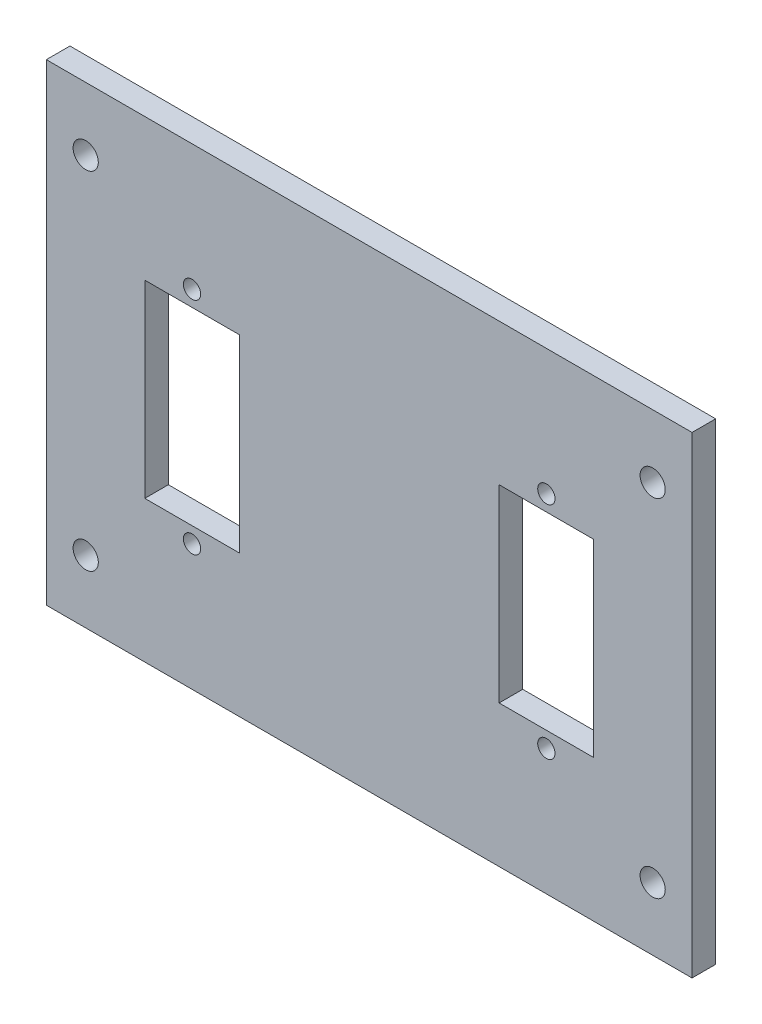
ISO-10303-21;
HEADER;
FILE_DESCRIPTION(('STEP AP214'),'2;1');
FILE_NAME('part.step','',(''),(''),'','','');
FILE_SCHEMA(('AUTOMOTIVE_DESIGN { 1 0 10303 214 1 1 1 1 }'));
ENDSEC;
DATA;
#1=APPLICATION_CONTEXT('core data for automotive mechanical design processes');
#2=APPLICATION_PROTOCOL_DEFINITION('international standard','automotive_design',2000,#1);
#3=PRODUCT_CONTEXT('',#1,'mechanical');
#4=PRODUCT('Part','Part','',(#3));
#5=PRODUCT_RELATED_PRODUCT_CATEGORY('part','',(#4));
#6=PRODUCT_DEFINITION_FORMATION('','',#4);
#7=PRODUCT_DEFINITION_CONTEXT('part definition',#1,'design');
#8=PRODUCT_DEFINITION('design','',#6,#7);
#9=PRODUCT_DEFINITION_SHAPE('','',#8);
#10=(LENGTH_UNIT() NAMED_UNIT(*) SI_UNIT(.MILLI.,.METRE.));
#11=(NAMED_UNIT(*) PLANE_ANGLE_UNIT() SI_UNIT($,.RADIAN.));
#12=(NAMED_UNIT(*) SI_UNIT($,.STERADIAN.) SOLID_ANGLE_UNIT());
#13=UNCERTAINTY_MEASURE_WITH_UNIT(LENGTH_MEASURE(1.E-05),#10,'distance_accuracy_value','');
#14=(GEOMETRIC_REPRESENTATION_CONTEXT(3) GLOBAL_UNCERTAINTY_ASSIGNED_CONTEXT((#13)) GLOBAL_UNIT_ASSIGNED_CONTEXT((#10,
#11,#12)) REPRESENTATION_CONTEXT('',''));
#15=CARTESIAN_POINT('',(0.,0.,0.));
#16=DIRECTION('',(0.,0.,1.));
#17=DIRECTION('',(1.,0.,0.));
#18=AXIS2_PLACEMENT_3D('',#15,#16,#17);
#19=CARTESIAN_POINT('',(0.,0.,3.));
#20=DIRECTION('',(0.,0.,-1.));
#21=DIRECTION('',(-1.,0.,0.));
#22=AXIS2_PLACEMENT_3D('',#19,#20,#21);
#23=PLANE('',#22);
#24=CARTESIAN_POINT('',(63.5,16.,3.));
#25=DIRECTION('',(0.,0.,1.));
#26=DIRECTION('',(1.,0.,0.));
#27=AXIS2_PLACEMENT_3D('',#24,#25,#26);
#28=CIRCLE('',#27,1.10000000000001);
#29=CARTESIAN_POINT('',(64.6,16.,3.));
#30=VERTEX_POINT('',#29);
#31=EDGE_CURVE('E186',#30,#30,#28,.T.);
#32=ORIENTED_EDGE('',*,*,#31,.F.);
#33=EDGE_LOOP('',(#32));
#34=FACE_BOUND('',#33,.T.);
#35=CARTESIAN_POINT('',(5.,52.,3.));
#36=DIRECTION('',(0.,0.,1.));
#37=DIRECTION('',(1.,0.,0.));
#38=AXIS2_PLACEMENT_3D('',#35,#36,#37);
#39=CIRCLE('',#38,1.6);
#40=CARTESIAN_POINT('',(6.6,52.,3.));
#41=VERTEX_POINT('',#40);
#42=EDGE_CURVE('E194',#41,#41,#39,.T.);
#43=ORIENTED_EDGE('',*,*,#42,.F.);
#44=EDGE_LOOP('',(#43));
#45=FACE_BOUND('',#44,.T.);
#46=CARTESIAN_POINT('',(77.,52.,3.));
#47=DIRECTION('',(0.,0.,1.));
#48=DIRECTION('',(-1.,0.,0.));
#49=AXIS2_PLACEMENT_3D('',#46,#47,#48);
#50=CIRCLE('',#49,1.60000000000001);
#51=CARTESIAN_POINT('',(75.4,52.,3.));
#52=VERTEX_POINT('',#51);
#53=EDGE_CURVE('E202',#52,#52,#50,.T.);
#54=ORIENTED_EDGE('',*,*,#53,.F.);
#55=EDGE_LOOP('',(#54));
#56=FACE_BOUND('',#55,.T.);
#57=CARTESIAN_POINT('',(5.,8.,3.));
#58=DIRECTION('',(0.,0.,1.));
#59=DIRECTION('',(-1.,0.,0.));
#60=AXIS2_PLACEMENT_3D('',#57,#58,#59);
#61=CIRCLE('',#60,1.6);
#62=CARTESIAN_POINT('',(3.4,8.,3.));
#63=VERTEX_POINT('',#62);
#64=EDGE_CURVE('E210',#63,#63,#61,.T.);
#65=ORIENTED_EDGE('',*,*,#64,.F.);
#66=EDGE_LOOP('',(#65));
#67=FACE_BOUND('',#66,.T.);
#68=CARTESIAN_POINT('',(77.,8.,3.));
#69=DIRECTION('',(0.,0.,1.));
#70=DIRECTION('',(1.,0.,0.));
#71=AXIS2_PLACEMENT_3D('',#68,#69,#70);
#72=CIRCLE('',#71,1.6);
#73=CARTESIAN_POINT('',(78.6,8.,3.));
#74=VERTEX_POINT('',#73);
#75=EDGE_CURVE('E218',#74,#74,#72,.T.);
#76=ORIENTED_EDGE('',*,*,#75,.F.);
#77=EDGE_LOOP('',(#76));
#78=FACE_BOUND('',#77,.T.);
#79=CARTESIAN_POINT('',(18.5,16.,3.));
#80=DIRECTION('',(0.,0.,1.));
#81=DIRECTION('',(-1.,0.,0.));
#82=AXIS2_PLACEMENT_3D('',#79,#80,#81);
#83=CIRCLE('',#82,1.1);
#84=CARTESIAN_POINT('',(17.4,16.,3.));
#85=VERTEX_POINT('',#84);
#86=EDGE_CURVE('E226',#85,#85,#83,.T.);
#87=ORIENTED_EDGE('',*,*,#86,.F.);
#88=EDGE_LOOP('',(#87));
#89=FACE_BOUND('',#88,.T.);
#90=CARTESIAN_POINT('',(18.5,44.,3.));
#91=DIRECTION('',(0.,0.,1.));
#92=DIRECTION('',(1.,0.,0.));
#93=AXIS2_PLACEMENT_3D('',#90,#91,#92);
#94=CIRCLE('',#93,1.1);
#95=CARTESIAN_POINT('',(19.6,44.,3.));
#96=VERTEX_POINT('',#95);
#97=EDGE_CURVE('E234',#96,#96,#94,.T.);
#98=ORIENTED_EDGE('',*,*,#97,.F.);
#99=EDGE_LOOP('',(#98));
#100=FACE_BOUND('',#99,.T.);
#101=DIRECTION('',(0.,-1.,0.));
#102=VECTOR('',#101,1.);
#103=CARTESIAN_POINT('',(12.5,18.,3.));
#104=LINE('',#103,#102);
#105=CARTESIAN_POINT('',(12.5,42.,3.));
#106=VERTEX_POINT('',#105);
#107=CARTESIAN_POINT('',(12.5,18.,3.));
#108=VERTEX_POINT('',#107);
#109=EDGE_CURVE('E242',#106,#108,#104,.T.);
#110=ORIENTED_EDGE('',*,*,#109,.F.);
#111=DIRECTION('',(-1.,0.,0.));
#112=VECTOR('',#111,1.);
#113=CARTESIAN_POINT('',(12.5,42.,3.));
#114=LINE('',#113,#112);
#115=CARTESIAN_POINT('',(24.5,42.,3.));
#116=VERTEX_POINT('',#115);
#117=EDGE_CURVE('E253',#116,#106,#114,.T.);
#118=ORIENTED_EDGE('',*,*,#117,.F.);
#119=DIRECTION('',(0.,1.,0.));
#120=VECTOR('',#119,1.);
#121=CARTESIAN_POINT('',(24.5,18.,3.));
#122=LINE('',#121,#120);
#123=CARTESIAN_POINT('',(24.5,18.,3.));
#124=VERTEX_POINT('',#123);
#125=EDGE_CURVE('E249',#124,#116,#122,.T.);
#126=ORIENTED_EDGE('',*,*,#125,.F.);
#127=DIRECTION('',(1.,0.,0.));
#128=VECTOR('',#127,1.);
#129=CARTESIAN_POINT('',(12.5,18.,3.));
#130=LINE('',#129,#128);
#131=EDGE_CURVE('E245',#108,#124,#130,.T.);
#132=ORIENTED_EDGE('',*,*,#131,.F.);
#133=EDGE_LOOP('',(#110,#118,#126,#132));
#134=FACE_BOUND('',#133,.T.);
#135=DIRECTION('',(0.,-1.,0.));
#136=VECTOR('',#135,1.);
#137=CARTESIAN_POINT('',(0.,0.,3.));
#138=LINE('',#137,#136);
#139=CARTESIAN_POINT('',(0.,60.,3.));
#140=VERTEX_POINT('',#139);
#141=CARTESIAN_POINT('',(0.,0.,3.));
#142=VERTEX_POINT('',#141);
#143=EDGE_CURVE('E285',#140,#142,#138,.T.);
#144=ORIENTED_EDGE('',*,*,#143,.T.);
#145=DIRECTION('',(1.,0.,0.));
#146=VECTOR('',#145,1.);
#147=CARTESIAN_POINT('',(0.,0.,3.));
#148=LINE('',#147,#146);
#149=CARTESIAN_POINT('',(82.,0.,3.));
#150=VERTEX_POINT('',#149);
#151=EDGE_CURVE('E289',#142,#150,#148,.T.);
#152=ORIENTED_EDGE('',*,*,#151,.T.);
#153=DIRECTION('',(0.,1.,0.));
#154=VECTOR('',#153,1.);
#155=CARTESIAN_POINT('',(82.,0.,3.));
#156=LINE('',#155,#154);
#157=CARTESIAN_POINT('',(82.,60.,3.));
#158=VERTEX_POINT('',#157);
#159=EDGE_CURVE('E293',#150,#158,#156,.T.);
#160=ORIENTED_EDGE('',*,*,#159,.T.);
#161=DIRECTION('',(-1.,0.,0.));
#162=VECTOR('',#161,1.);
#163=CARTESIAN_POINT('',(0.,60.,3.));
#164=LINE('',#163,#162);
#165=EDGE_CURVE('E296',#158,#140,#164,.T.);
#166=ORIENTED_EDGE('',*,*,#165,.T.);
#167=EDGE_LOOP('',(#144,#152,#160,#166));
#168=FACE_BOUND('',#167,.T.);
#169=DIRECTION('',(0.,1.,0.));
#170=VECTOR('',#169,1.);
#171=CARTESIAN_POINT('',(69.5,18.,3.));
#172=LINE('',#171,#170);
#173=CARTESIAN_POINT('',(69.5,18.,3.));
#174=VERTEX_POINT('',#173);
#175=CARTESIAN_POINT('',(69.5,42.,3.));
#176=VERTEX_POINT('',#175);
#177=EDGE_CURVE('E135',#174,#176,#172,.T.);
#178=ORIENTED_EDGE('',*,*,#177,.F.);
#179=DIRECTION('',(1.,0.,0.));
#180=VECTOR('',#179,1.);
#181=CARTESIAN_POINT('',(69.5,18.,3.));
#182=LINE('',#181,#180);
#183=CARTESIAN_POINT('',(57.5,18.,3.));
#184=VERTEX_POINT('',#183);
#185=EDGE_CURVE('E162',#184,#174,#182,.T.);
#186=ORIENTED_EDGE('',*,*,#185,.F.);
#187=DIRECTION('',(0.,-1.,0.));
#188=VECTOR('',#187,1.);
#189=CARTESIAN_POINT('',(57.5,18.,3.));
#190=LINE('',#189,#188);
#191=CARTESIAN_POINT('',(57.5,42.,3.));
#192=VERTEX_POINT('',#191);
#193=EDGE_CURVE('E158',#192,#184,#190,.T.);
#194=ORIENTED_EDGE('',*,*,#193,.F.);
#195=DIRECTION('',(-1.,0.,0.));
#196=VECTOR('',#195,1.);
#197=CARTESIAN_POINT('',(69.5,42.,3.));
#198=LINE('',#197,#196);
#199=EDGE_CURVE('E144',#176,#192,#198,.T.);
#200=ORIENTED_EDGE('',*,*,#199,.F.);
#201=EDGE_LOOP('',(#178,#186,#194,#200));
#202=FACE_BOUND('',#201,.T.);
#203=CARTESIAN_POINT('',(63.5,44.,3.));
#204=DIRECTION('',(0.,0.,1.));
#205=DIRECTION('',(-1.,0.,0.));
#206=AXIS2_PLACEMENT_3D('',#203,#204,#205);
#207=CIRCLE('',#206,1.10000000000001);
#208=CARTESIAN_POINT('',(62.4,44.,3.));
#209=VERTEX_POINT('',#208);
#210=EDGE_CURVE('E170',#209,#209,#207,.T.);
#211=ORIENTED_EDGE('',*,*,#210,.F.);
#212=EDGE_LOOP('',(#211));
#213=FACE_BOUND('',#212,.T.);
#214=ADVANCED_FACE('F45',(#34,#45,#56,#67,#78,#89,#100,#134,#168,#202,#213),#23,.F.);
#215=CARTESIAN_POINT('',(0.,0.,0.));
#216=DIRECTION('',(0.,0.,-1.));
#217=DIRECTION('',(-1.,0.,0.));
#218=AXIS2_PLACEMENT_3D('',#215,#216,#217);
#219=PLANE('',#218);
#220=DIRECTION('',(1.,0.,0.));
#221=VECTOR('',#220,1.);
#222=CARTESIAN_POINT('',(69.5,18.,0.));
#223=LINE('',#222,#221);
#224=CARTESIAN_POINT('',(57.5,18.,0.));
#225=VERTEX_POINT('',#224);
#226=CARTESIAN_POINT('',(69.5,18.,0.));
#227=VERTEX_POINT('',#226);
#228=EDGE_CURVE('E145',#225,#227,#223,.T.);
#229=ORIENTED_EDGE('',*,*,#228,.T.);
#230=DIRECTION('',(0.,1.,0.));
#231=VECTOR('',#230,1.);
#232=CARTESIAN_POINT('',(69.5,18.,0.));
#233=LINE('',#232,#231);
#234=CARTESIAN_POINT('',(69.5,42.,0.));
#235=VERTEX_POINT('',#234);
#236=EDGE_CURVE('E69',#227,#235,#233,.T.);
#237=ORIENTED_EDGE('',*,*,#236,.T.);
#238=DIRECTION('',(-1.,0.,0.));
#239=VECTOR('',#238,1.);
#240=CARTESIAN_POINT('',(69.5,42.,0.));
#241=LINE('',#240,#239);
#242=CARTESIAN_POINT('',(57.5,42.,0.));
#243=VERTEX_POINT('',#242);
#244=EDGE_CURVE('E151',#235,#243,#241,.T.);
#245=ORIENTED_EDGE('',*,*,#244,.T.);
#246=DIRECTION('',(0.,-1.,0.));
#247=VECTOR('',#246,1.);
#248=CARTESIAN_POINT('',(57.5,18.,0.));
#249=LINE('',#248,#247);
#250=EDGE_CURVE('E173',#243,#225,#249,.T.);
#251=ORIENTED_EDGE('',*,*,#250,.T.);
#252=EDGE_LOOP('',(#229,#237,#245,#251));
#253=FACE_BOUND('',#252,.T.);
#254=CARTESIAN_POINT('',(63.5,16.,0.));
#255=DIRECTION('',(0.,0.,1.));
#256=DIRECTION('',(1.,0.,0.));
#257=AXIS2_PLACEMENT_3D('',#254,#255,#256);
#258=CIRCLE('',#257,1.10000000000001);
#259=CARTESIAN_POINT('',(64.6,16.,0.));
#260=VERTEX_POINT('',#259);
#261=EDGE_CURVE('E153',#260,#260,#258,.T.);
#262=ORIENTED_EDGE('',*,*,#261,.T.);
#263=EDGE_LOOP('',(#262));
#264=FACE_BOUND('',#263,.T.);
#265=CARTESIAN_POINT('',(77.,52.,0.));
#266=DIRECTION('',(0.,0.,1.));
#267=DIRECTION('',(-1.,0.,0.));
#268=AXIS2_PLACEMENT_3D('',#265,#266,#267);
#269=CIRCLE('',#268,1.60000000000001);
#270=CARTESIAN_POINT('',(75.4,52.,0.));
#271=VERTEX_POINT('',#270);
#272=EDGE_CURVE('E198',#271,#271,#269,.T.);
#273=ORIENTED_EDGE('',*,*,#272,.T.);
#274=EDGE_LOOP('',(#273));
#275=FACE_BOUND('',#274,.T.);
#276=CARTESIAN_POINT('',(77.,8.,0.));
#277=DIRECTION('',(0.,0.,1.));
#278=DIRECTION('',(1.,0.,0.));
#279=AXIS2_PLACEMENT_3D('',#276,#277,#278);
#280=CIRCLE('',#279,1.6);
#281=CARTESIAN_POINT('',(78.6,8.,0.));
#282=VERTEX_POINT('',#281);
#283=EDGE_CURVE('E214',#282,#282,#280,.T.);
#284=ORIENTED_EDGE('',*,*,#283,.T.);
#285=EDGE_LOOP('',(#284));
#286=FACE_BOUND('',#285,.T.);
#287=CARTESIAN_POINT('',(18.5,44.,0.));
#288=DIRECTION('',(0.,0.,1.));
#289=DIRECTION('',(1.,0.,0.));
#290=AXIS2_PLACEMENT_3D('',#287,#288,#289);
#291=CIRCLE('',#290,1.1);
#292=CARTESIAN_POINT('',(19.6,44.,0.));
#293=VERTEX_POINT('',#292);
#294=EDGE_CURVE('E230',#293,#293,#291,.T.);
#295=ORIENTED_EDGE('',*,*,#294,.T.);
#296=EDGE_LOOP('',(#295));
#297=FACE_BOUND('',#296,.T.);
#298=DIRECTION('',(0.,-1.,0.));
#299=VECTOR('',#298,1.);
#300=CARTESIAN_POINT('',(0.,0.,0.));
#301=LINE('',#300,#299);
#302=CARTESIAN_POINT('',(0.,60.,0.));
#303=VERTEX_POINT('',#302);
#304=CARTESIAN_POINT('',(0.,0.,0.));
#305=VERTEX_POINT('',#304);
#306=EDGE_CURVE('E284',#303,#305,#301,.T.);
#307=ORIENTED_EDGE('',*,*,#306,.F.);
#308=DIRECTION('',(-1.,0.,0.));
#309=VECTOR('',#308,1.);
#310=CARTESIAN_POINT('',(0.,60.,0.));
#311=LINE('',#310,#309);
#312=CARTESIAN_POINT('',(82.,60.,0.));
#313=VERTEX_POINT('',#312);
#314=EDGE_CURVE('E290',#313,#303,#311,.T.);
#315=ORIENTED_EDGE('',*,*,#314,.F.);
#316=DIRECTION('',(0.,1.,0.));
#317=VECTOR('',#316,1.);
#318=CARTESIAN_POINT('',(82.,0.,0.));
#319=LINE('',#318,#317);
#320=CARTESIAN_POINT('',(82.,0.,0.));
#321=VERTEX_POINT('',#320);
#322=EDGE_CURVE('E306',#321,#313,#319,.T.);
#323=ORIENTED_EDGE('',*,*,#322,.F.);
#324=DIRECTION('',(1.,0.,0.));
#325=VECTOR('',#324,1.);
#326=CARTESIAN_POINT('',(0.,0.,0.));
#327=LINE('',#326,#325);
#328=EDGE_CURVE('E303',#305,#321,#327,.T.);
#329=ORIENTED_EDGE('',*,*,#328,.F.);
#330=EDGE_LOOP('',(#307,#315,#323,#329));
#331=FACE_BOUND('',#330,.T.);
#332=DIRECTION('',(-1.,0.,0.));
#333=VECTOR('',#332,1.);
#334=CARTESIAN_POINT('',(12.5,42.,0.));
#335=LINE('',#334,#333);
#336=CARTESIAN_POINT('',(24.5,42.,0.));
#337=VERTEX_POINT('',#336);
#338=CARTESIAN_POINT('',(12.5,42.,0.));
#339=VERTEX_POINT('',#338);
#340=EDGE_CURVE('E246',#337,#339,#335,.T.);
#341=ORIENTED_EDGE('',*,*,#340,.T.);
#342=DIRECTION('',(0.,-1.,0.));
#343=VECTOR('',#342,1.);
#344=CARTESIAN_POINT('',(12.5,18.,0.));
#345=LINE('',#344,#343);
#346=CARTESIAN_POINT('',(12.5,18.,0.));
#347=VERTEX_POINT('',#346);
#348=EDGE_CURVE('E238',#339,#347,#345,.T.);
#349=ORIENTED_EDGE('',*,*,#348,.T.);
#350=DIRECTION('',(1.,0.,0.));
#351=VECTOR('',#350,1.);
#352=CARTESIAN_POINT('',(12.5,18.,0.));
#353=LINE('',#352,#351);
#354=CARTESIAN_POINT('',(24.5,18.,0.));
#355=VERTEX_POINT('',#354);
#356=EDGE_CURVE('E260',#347,#355,#353,.T.);
#357=ORIENTED_EDGE('',*,*,#356,.T.);
#358=DIRECTION('',(0.,1.,0.));
#359=VECTOR('',#358,1.);
#360=CARTESIAN_POINT('',(24.5,18.,0.));
#361=LINE('',#360,#359);
#362=EDGE_CURVE('E264',#355,#337,#361,.T.);
#363=ORIENTED_EDGE('',*,*,#362,.T.);
#364=EDGE_LOOP('',(#341,#349,#357,#363));
#365=FACE_BOUND('',#364,.T.);
#366=CARTESIAN_POINT('',(18.5,16.,0.));
#367=DIRECTION('',(0.,0.,1.));
#368=DIRECTION('',(-1.,0.,0.));
#369=AXIS2_PLACEMENT_3D('',#366,#367,#368);
#370=CIRCLE('',#369,1.1);
#371=CARTESIAN_POINT('',(17.4,16.,0.));
#372=VERTEX_POINT('',#371);
#373=EDGE_CURVE('E222',#372,#372,#370,.T.);
#374=ORIENTED_EDGE('',*,*,#373,.T.);
#375=EDGE_LOOP('',(#374));
#376=FACE_BOUND('',#375,.T.);
#377=CARTESIAN_POINT('',(5.,8.,0.));
#378=DIRECTION('',(0.,0.,1.));
#379=DIRECTION('',(-1.,0.,0.));
#380=AXIS2_PLACEMENT_3D('',#377,#378,#379);
#381=CIRCLE('',#380,1.6);
#382=CARTESIAN_POINT('',(3.4,8.,0.));
#383=VERTEX_POINT('',#382);
#384=EDGE_CURVE('E206',#383,#383,#381,.T.);
#385=ORIENTED_EDGE('',*,*,#384,.T.);
#386=EDGE_LOOP('',(#385));
#387=FACE_BOUND('',#386,.T.);
#388=CARTESIAN_POINT('',(5.,52.,0.));
#389=DIRECTION('',(0.,0.,1.));
#390=DIRECTION('',(1.,0.,0.));
#391=AXIS2_PLACEMENT_3D('',#388,#389,#390);
#392=CIRCLE('',#391,1.6);
#393=CARTESIAN_POINT('',(6.6,52.,0.));
#394=VERTEX_POINT('',#393);
#395=EDGE_CURVE('E190',#394,#394,#392,.T.);
#396=ORIENTED_EDGE('',*,*,#395,.T.);
#397=EDGE_LOOP('',(#396));
#398=FACE_BOUND('',#397,.T.);
#399=CARTESIAN_POINT('',(63.5,44.,0.));
#400=DIRECTION('',(0.,0.,1.));
#401=DIRECTION('',(-1.,0.,0.));
#402=AXIS2_PLACEMENT_3D('',#399,#400,#401);
#403=CIRCLE('',#402,1.10000000000001);
#404=CARTESIAN_POINT('',(62.4,44.,0.));
#405=VERTEX_POINT('',#404);
#406=EDGE_CURVE('E441',#405,#405,#403,.T.);
#407=ORIENTED_EDGE('',*,*,#406,.T.);
#408=EDGE_LOOP('',(#407));
#409=FACE_BOUND('',#408,.T.);
#410=ADVANCED_FACE('F329',(#253,#264,#275,#286,#297,#331,#365,#376,#387,#398,#409),#219,.T.);
#411=CARTESIAN_POINT('',(0.,0.,3.));
#412=DIRECTION('',(1.,0.,0.));
#413=DIRECTION('',(0.,0.,-1.));
#414=AXIS2_PLACEMENT_3D('',#411,#412,#413);
#415=PLANE('',#414);
#416=ORIENTED_EDGE('',*,*,#306,.T.);
#417=DIRECTION('',(0.,0.,-1.));
#418=VECTOR('',#417,1.);
#419=CARTESIAN_POINT('',(0.,0.,3.));
#420=LINE('',#419,#418);
#421=EDGE_CURVE('E11',#142,#305,#420,.T.);
#422=ORIENTED_EDGE('',*,*,#421,.F.);
#423=ORIENTED_EDGE('',*,*,#143,.F.);
#424=DIRECTION('',(0.,0.,-1.));
#425=VECTOR('',#424,1.);
#426=CARTESIAN_POINT('',(0.,60.,3.));
#427=LINE('',#426,#425);
#428=EDGE_CURVE('E299',#140,#303,#427,.T.);
#429=ORIENTED_EDGE('',*,*,#428,.T.);
#430=EDGE_LOOP('',(#416,#422,#423,#429));
#431=FACE_BOUND('',#430,.T.);
#432=ADVANCED_FACE('F47',(#431),#415,.F.);
#433=CARTESIAN_POINT('',(0.,0.,3.));
#434=DIRECTION('',(0.,1.,0.));
#435=DIRECTION('',(0.,0.,1.));
#436=AXIS2_PLACEMENT_3D('',#433,#434,#435);
#437=PLANE('',#436);
#438=ORIENTED_EDGE('',*,*,#328,.T.);
#439=DIRECTION('',(0.,0.,-1.));
#440=VECTOR('',#439,1.);
#441=CARTESIAN_POINT('',(82.,0.,3.));
#442=LINE('',#441,#440);
#443=EDGE_CURVE('E54',#150,#321,#442,.T.);
#444=ORIENTED_EDGE('',*,*,#443,.F.);
#445=ORIENTED_EDGE('',*,*,#151,.F.);
#446=ORIENTED_EDGE('',*,*,#421,.T.);
#447=EDGE_LOOP('',(#438,#444,#445,#446));
#448=FACE_BOUND('',#447,.T.);
#449=ADVANCED_FACE('F339',(#448),#437,.F.);
#450=CARTESIAN_POINT('',(82.,0.,3.));
#451=DIRECTION('',(-1.,0.,0.));
#452=DIRECTION('',(0.,0.,1.));
#453=AXIS2_PLACEMENT_3D('',#450,#451,#452);
#454=PLANE('',#453);
#455=ORIENTED_EDGE('',*,*,#322,.T.);
#456=DIRECTION('',(0.,0.,-1.));
#457=VECTOR('',#456,1.);
#458=CARTESIAN_POINT('',(82.,60.,3.));
#459=LINE('',#458,#457);
#460=EDGE_CURVE('E314',#158,#313,#459,.T.);
#461=ORIENTED_EDGE('',*,*,#460,.F.);
#462=ORIENTED_EDGE('',*,*,#159,.F.);
#463=ORIENTED_EDGE('',*,*,#443,.T.);
#464=EDGE_LOOP('',(#455,#461,#462,#463));
#465=FACE_BOUND('',#464,.T.);
#466=ADVANCED_FACE('F323',(#465),#454,.F.);
#467=CARTESIAN_POINT('',(0.,60.,3.));
#468=DIRECTION('',(0.,-1.,0.));
#469=DIRECTION('',(0.,0.,-1.));
#470=AXIS2_PLACEMENT_3D('',#467,#468,#469);
#471=PLANE('',#470);
#472=ORIENTED_EDGE('',*,*,#314,.T.);
#473=ORIENTED_EDGE('',*,*,#428,.F.);
#474=ORIENTED_EDGE('',*,*,#165,.F.);
#475=ORIENTED_EDGE('',*,*,#460,.T.);
#476=EDGE_LOOP('',(#472,#473,#474,#475));
#477=FACE_BOUND('',#476,.T.);
#478=ADVANCED_FACE('F333',(#477),#471,.F.);
#479=CARTESIAN_POINT('',(12.5,18.,3.));
#480=DIRECTION('',(1.,0.,0.));
#481=DIRECTION('',(0.,0.,-1.));
#482=AXIS2_PLACEMENT_3D('',#479,#480,#481);
#483=PLANE('',#482);
#484=ORIENTED_EDGE('',*,*,#348,.F.);
#485=DIRECTION('',(0.,0.,-1.));
#486=VECTOR('',#485,1.);
#487=CARTESIAN_POINT('',(12.5,42.,3.));
#488=LINE('',#487,#486);
#489=EDGE_CURVE('E256',#106,#339,#488,.T.);
#490=ORIENTED_EDGE('',*,*,#489,.F.);
#491=ORIENTED_EDGE('',*,*,#109,.T.);
#492=DIRECTION('',(0.,0.,-1.));
#493=VECTOR('',#492,1.);
#494=CARTESIAN_POINT('',(12.5,18.,3.));
#495=LINE('',#494,#493);
#496=EDGE_CURVE('E280',#108,#347,#495,.T.);
#497=ORIENTED_EDGE('',*,*,#496,.T.);
#498=EDGE_LOOP('',(#484,#490,#491,#497));
#499=FACE_BOUND('',#498,.T.);
#500=ADVANCED_FACE('F357',(#499),#483,.T.);
#501=CARTESIAN_POINT('',(12.5,18.,3.));
#502=DIRECTION('',(0.,1.,0.));
#503=DIRECTION('',(0.,0.,1.));
#504=AXIS2_PLACEMENT_3D('',#501,#502,#503);
#505=PLANE('',#504);
#506=ORIENTED_EDGE('',*,*,#356,.F.);
#507=ORIENTED_EDGE('',*,*,#496,.F.);
#508=ORIENTED_EDGE('',*,*,#131,.T.);
#509=DIRECTION('',(0.,0.,-1.));
#510=VECTOR('',#509,1.);
#511=CARTESIAN_POINT('',(24.5,18.,3.));
#512=LINE('',#511,#510);
#513=EDGE_CURVE('E277',#124,#355,#512,.T.);
#514=ORIENTED_EDGE('',*,*,#513,.T.);
#515=EDGE_LOOP('',(#506,#507,#508,#514));
#516=FACE_BOUND('',#515,.T.);
#517=ADVANCED_FACE('F364',(#516),#505,.T.);
#518=CARTESIAN_POINT('',(24.5,18.,3.));
#519=DIRECTION('',(-1.,0.,0.));
#520=DIRECTION('',(0.,-1.,0.));
#521=AXIS2_PLACEMENT_3D('',#518,#519,#520);
#522=PLANE('',#521);
#523=ORIENTED_EDGE('',*,*,#362,.F.);
#524=ORIENTED_EDGE('',*,*,#513,.F.);
#525=ORIENTED_EDGE('',*,*,#125,.T.);
#526=DIRECTION('',(0.,0.,-1.));
#527=VECTOR('',#526,1.);
#528=CARTESIAN_POINT('',(24.5,42.,3.));
#529=LINE('',#528,#527);
#530=EDGE_CURVE('E274',#116,#337,#529,.T.);
#531=ORIENTED_EDGE('',*,*,#530,.T.);
#532=EDGE_LOOP('',(#523,#524,#525,#531));
#533=FACE_BOUND('',#532,.T.);
#534=ADVANCED_FACE('F369',(#533),#522,.T.);
#535=CARTESIAN_POINT('',(12.5,42.,3.));
#536=DIRECTION('',(0.,-1.,0.));
#537=DIRECTION('',(0.,0.,-1.));
#538=AXIS2_PLACEMENT_3D('',#535,#536,#537);
#539=PLANE('',#538);
#540=ORIENTED_EDGE('',*,*,#340,.F.);
#541=ORIENTED_EDGE('',*,*,#530,.F.);
#542=ORIENTED_EDGE('',*,*,#117,.T.);
#543=ORIENTED_EDGE('',*,*,#489,.T.);
#544=EDGE_LOOP('',(#540,#541,#542,#543));
#545=FACE_BOUND('',#544,.T.);
#546=ADVANCED_FACE('F376',(#545),#539,.T.);
#547=CARTESIAN_POINT('',(18.5,44.,3.));
#548=DIRECTION('',(0.,0.,-1.));
#549=DIRECTION('',(-1.,0.,0.));
#550=AXIS2_PLACEMENT_3D('',#547,#548,#549);
#551=CYLINDRICAL_SURFACE('',#550,1.1);
#552=ORIENTED_EDGE('',*,*,#97,.T.);
#553=EDGE_LOOP('',(#552));
#554=FACE_BOUND('',#553,.T.);
#555=ORIENTED_EDGE('',*,*,#294,.F.);
#556=EDGE_LOOP('',(#555));
#557=FACE_BOUND('',#556,.T.);
#558=ADVANCED_FACE('F390',(#554,#557),#551,.F.);
#559=CARTESIAN_POINT('',(18.5,16.,3.));
#560=DIRECTION('',(0.,0.,-1.));
#561=DIRECTION('',(-1.,0.,0.));
#562=AXIS2_PLACEMENT_3D('',#559,#560,#561);
#563=CYLINDRICAL_SURFACE('',#562,1.1);
#564=ORIENTED_EDGE('',*,*,#86,.T.);
#565=EDGE_LOOP('',(#564));
#566=FACE_BOUND('',#565,.T.);
#567=ORIENTED_EDGE('',*,*,#373,.F.);
#568=EDGE_LOOP('',(#567));
#569=FACE_BOUND('',#568,.T.);
#570=ADVANCED_FACE('F395',(#566,#569),#563,.F.);
#571=CARTESIAN_POINT('',(77.,8.,3.));
#572=DIRECTION('',(0.,0.,-1.));
#573=DIRECTION('',(-1.,0.,0.));
#574=AXIS2_PLACEMENT_3D('',#571,#572,#573);
#575=CYLINDRICAL_SURFACE('',#574,1.6);
#576=ORIENTED_EDGE('',*,*,#75,.T.);
#577=EDGE_LOOP('',(#576));
#578=FACE_BOUND('',#577,.T.);
#579=ORIENTED_EDGE('',*,*,#283,.F.);
#580=EDGE_LOOP('',(#579));
#581=FACE_BOUND('',#580,.T.);
#582=ADVANCED_FACE('F399',(#578,#581),#575,.F.);
#583=CARTESIAN_POINT('',(5.,8.,3.));
#584=DIRECTION('',(0.,0.,-1.));
#585=DIRECTION('',(-1.,0.,0.));
#586=AXIS2_PLACEMENT_3D('',#583,#584,#585);
#587=CYLINDRICAL_SURFACE('',#586,1.6);
#588=ORIENTED_EDGE('',*,*,#64,.T.);
#589=EDGE_LOOP('',(#588));
#590=FACE_BOUND('',#589,.T.);
#591=ORIENTED_EDGE('',*,*,#384,.F.);
#592=EDGE_LOOP('',(#591));
#593=FACE_BOUND('',#592,.T.);
#594=ADVANCED_FACE('F403',(#590,#593),#587,.F.);
#595=CARTESIAN_POINT('',(77.,52.,3.));
#596=DIRECTION('',(0.,0.,-1.));
#597=DIRECTION('',(-1.,0.,0.));
#598=AXIS2_PLACEMENT_3D('',#595,#596,#597);
#599=CYLINDRICAL_SURFACE('',#598,1.60000000000001);
#600=ORIENTED_EDGE('',*,*,#53,.T.);
#601=EDGE_LOOP('',(#600));
#602=FACE_BOUND('',#601,.T.);
#603=ORIENTED_EDGE('',*,*,#272,.F.);
#604=EDGE_LOOP('',(#603));
#605=FACE_BOUND('',#604,.T.);
#606=ADVANCED_FACE('F407',(#602,#605),#599,.F.);
#607=CARTESIAN_POINT('',(5.,52.,3.));
#608=DIRECTION('',(0.,0.,-1.));
#609=DIRECTION('',(-1.,0.,0.));
#610=AXIS2_PLACEMENT_3D('',#607,#608,#609);
#611=CYLINDRICAL_SURFACE('',#610,1.6);
#612=ORIENTED_EDGE('',*,*,#42,.T.);
#613=EDGE_LOOP('',(#612));
#614=FACE_BOUND('',#613,.T.);
#615=ORIENTED_EDGE('',*,*,#395,.F.);
#616=EDGE_LOOP('',(#615));
#617=FACE_BOUND('',#616,.T.);
#618=ADVANCED_FACE('F411',(#614,#617),#611,.F.);
#619=CARTESIAN_POINT('',(63.5,16.,3.));
#620=DIRECTION('',(0.,0.,-1.));
#621=DIRECTION('',(-1.,0.,0.));
#622=AXIS2_PLACEMENT_3D('',#619,#620,#621);
#623=CYLINDRICAL_SURFACE('',#622,1.10000000000001);
#624=ORIENTED_EDGE('',*,*,#31,.T.);
#625=EDGE_LOOP('',(#624));
#626=FACE_BOUND('',#625,.T.);
#627=ORIENTED_EDGE('',*,*,#261,.F.);
#628=EDGE_LOOP('',(#627));
#629=FACE_BOUND('',#628,.T.);
#630=ADVANCED_FACE('F415',(#626,#629),#623,.F.);
#631=CARTESIAN_POINT('',(69.5,18.,3.));
#632=DIRECTION('',(-1.,0.,0.));
#633=DIRECTION('',(0.,0.,1.));
#634=AXIS2_PLACEMENT_3D('',#631,#632,#633);
#635=PLANE('',#634);
#636=ORIENTED_EDGE('',*,*,#236,.F.);
#637=DIRECTION('',(0.,0.,-1.));
#638=VECTOR('',#637,1.);
#639=CARTESIAN_POINT('',(69.5,18.,3.));
#640=LINE('',#639,#638);
#641=EDGE_CURVE('E139',#174,#227,#640,.T.);
#642=ORIENTED_EDGE('',*,*,#641,.F.);
#643=ORIENTED_EDGE('',*,*,#177,.T.);
#644=DIRECTION('',(0.,0.,-1.));
#645=VECTOR('',#644,1.);
#646=CARTESIAN_POINT('',(69.5,42.,3.));
#647=LINE('',#646,#645);
#648=EDGE_CURVE('E138',#176,#235,#647,.T.);
#649=ORIENTED_EDGE('',*,*,#648,.T.);
#650=EDGE_LOOP('',(#636,#642,#643,#649));
#651=FACE_BOUND('',#650,.T.);
#652=ADVANCED_FACE('F137',(#651),#635,.T.);
#653=CARTESIAN_POINT('',(69.5,42.,3.));
#654=DIRECTION('',(0.,-1.,0.));
#655=DIRECTION('',(0.,0.,-1.));
#656=AXIS2_PLACEMENT_3D('',#653,#654,#655);
#657=PLANE('',#656);
#658=ORIENTED_EDGE('',*,*,#244,.F.);
#659=ORIENTED_EDGE('',*,*,#648,.F.);
#660=ORIENTED_EDGE('',*,*,#199,.T.);
#661=DIRECTION('',(0.,0.,-1.));
#662=VECTOR('',#661,1.);
#663=CARTESIAN_POINT('',(57.5,42.,3.));
#664=LINE('',#663,#662);
#665=EDGE_CURVE('E154',#192,#243,#664,.T.);
#666=ORIENTED_EDGE('',*,*,#665,.T.);
#667=EDGE_LOOP('',(#658,#659,#660,#666));
#668=FACE_BOUND('',#667,.T.);
#669=ADVANCED_FACE('F148',(#668),#657,.T.);
#670=CARTESIAN_POINT('',(57.5,18.,3.));
#671=DIRECTION('',(1.,0.,0.));
#672=DIRECTION('',(0.,1.,0.));
#673=AXIS2_PLACEMENT_3D('',#670,#671,#672);
#674=PLANE('',#673);
#675=ORIENTED_EDGE('',*,*,#250,.F.);
#676=ORIENTED_EDGE('',*,*,#665,.F.);
#677=ORIENTED_EDGE('',*,*,#193,.T.);
#678=DIRECTION('',(0.,0.,-1.));
#679=VECTOR('',#678,1.);
#680=CARTESIAN_POINT('',(57.5,18.,3.));
#681=LINE('',#680,#679);
#682=EDGE_CURVE('E61',#184,#225,#681,.T.);
#683=ORIENTED_EDGE('',*,*,#682,.T.);
#684=EDGE_LOOP('',(#675,#676,#677,#683));
#685=FACE_BOUND('',#684,.T.);
#686=ADVANCED_FACE('F424',(#685),#674,.T.);
#687=CARTESIAN_POINT('',(69.5,18.,3.));
#688=DIRECTION('',(0.,1.,0.));
#689=DIRECTION('',(0.,0.,1.));
#690=AXIS2_PLACEMENT_3D('',#687,#688,#689);
#691=PLANE('',#690);
#692=ORIENTED_EDGE('',*,*,#228,.F.);
#693=ORIENTED_EDGE('',*,*,#682,.F.);
#694=ORIENTED_EDGE('',*,*,#185,.T.);
#695=ORIENTED_EDGE('',*,*,#641,.T.);
#696=EDGE_LOOP('',(#692,#693,#694,#695));
#697=FACE_BOUND('',#696,.T.);
#698=ADVANCED_FACE('F427',(#697),#691,.T.);
#699=CARTESIAN_POINT('',(63.5,44.,3.));
#700=DIRECTION('',(0.,0.,-1.));
#701=DIRECTION('',(-1.,0.,0.));
#702=AXIS2_PLACEMENT_3D('',#699,#700,#701);
#703=CYLINDRICAL_SURFACE('',#702,1.10000000000001);
#704=ORIENTED_EDGE('',*,*,#210,.T.);
#705=EDGE_LOOP('',(#704));
#706=FACE_BOUND('',#705,.T.);
#707=ORIENTED_EDGE('',*,*,#406,.F.);
#708=EDGE_LOOP('',(#707));
#709=FACE_BOUND('',#708,.T.);
#710=ADVANCED_FACE('F431',(#706,#709),#703,.F.);
#711=CLOSED_SHELL('',(#214,#410,#432,#449,#466,#478,#500,#517,#534,#546,#558,#570,#582,#594,
#606,#618,#630,#652,#669,#686,#698,#710));
#712=MANIFOLD_SOLID_BREP('B2',#711);
#713=ADVANCED_BREP_SHAPE_REPRESENTATION('',(#18,#712),#14);
#714=SHAPE_DEFINITION_REPRESENTATION(#9,#713);
ENDSEC;
END-ISO-10303-21;
